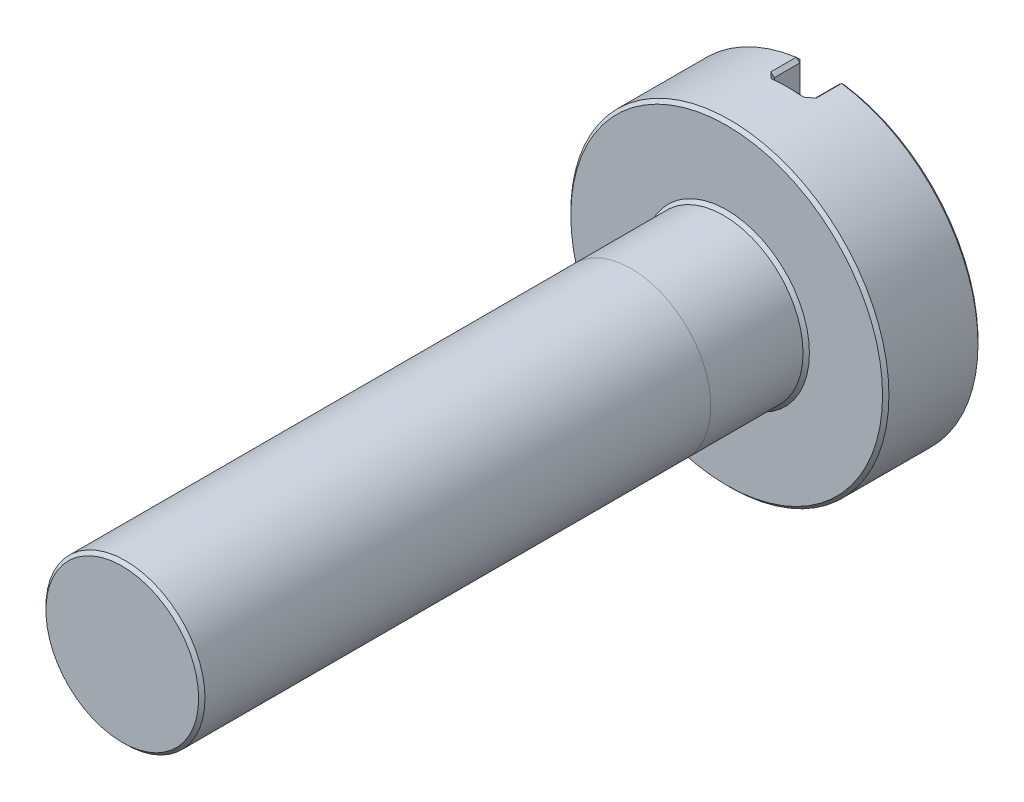
ISO-10303-21;
HEADER;
FILE_DESCRIPTION(('STEP AP214'),'2;1');
FILE_NAME('part.step','',(''),(''),'','','');
FILE_SCHEMA(('AUTOMOTIVE_DESIGN { 1 0 10303 214 1 1 1 1 }'));
ENDSEC;
DATA;
#1=APPLICATION_CONTEXT('core data for automotive mechanical design processes');
#2=APPLICATION_PROTOCOL_DEFINITION('international standard','automotive_design',2000,#1);
#3=PRODUCT_CONTEXT('',#1,'mechanical');
#4=PRODUCT('Part','Part','',(#3));
#5=PRODUCT_RELATED_PRODUCT_CATEGORY('part','',(#4));
#6=PRODUCT_DEFINITION_FORMATION('','',#4);
#7=PRODUCT_DEFINITION_CONTEXT('part definition',#1,'design');
#8=PRODUCT_DEFINITION('design','',#6,#7);
#9=PRODUCT_DEFINITION_SHAPE('','',#8);
#10=(LENGTH_UNIT() NAMED_UNIT(*) SI_UNIT(.MILLI.,.METRE.));
#11=(NAMED_UNIT(*) PLANE_ANGLE_UNIT() SI_UNIT($,.RADIAN.));
#12=(NAMED_UNIT(*) SI_UNIT($,.STERADIAN.) SOLID_ANGLE_UNIT());
#13=UNCERTAINTY_MEASURE_WITH_UNIT(LENGTH_MEASURE(1.E-05),#10,'distance_accuracy_value','');
#14=(GEOMETRIC_REPRESENTATION_CONTEXT(3) GLOBAL_UNCERTAINTY_ASSIGNED_CONTEXT((#13)) GLOBAL_UNIT_ASSIGNED_CONTEXT((#10,
#11,#12)) REPRESENTATION_CONTEXT('',''));
#15=CARTESIAN_POINT('',(0.,0.,0.));
#16=DIRECTION('',(0.,0.,1.));
#17=DIRECTION('',(1.,0.,0.));
#18=AXIS2_PLACEMENT_3D('',#15,#16,#17);
#19=CARTESIAN_POINT('',(0.,0.,11.));
#20=DIRECTION('',(0.,0.,-1.));
#21=DIRECTION('',(-1.,0.,0.));
#22=AXIS2_PLACEMENT_3D('',#19,#20,#21);
#23=CYLINDRICAL_SURFACE('',#22,1.25);
#24=CARTESIAN_POINT('',(0.,0.,10.95));
#25=DIRECTION('',(0.,0.,1.));
#26=DIRECTION('',(1.,0.,0.));
#27=AXIS2_PLACEMENT_3D('',#24,#25,#26);
#28=CIRCLE('',#27,1.25);
#29=CARTESIAN_POINT('',(1.25,0.,10.95));
#30=VERTEX_POINT('',#29);
#31=EDGE_CURVE('E202',#30,#30,#28,.F.);
#32=ORIENTED_EDGE('',*,*,#31,.T.);
#33=EDGE_LOOP('',(#32));
#34=FACE_BOUND('',#33,.T.);
#35=CARTESIAN_POINT('',(0.,0.,3.));
#36=DIRECTION('',(0.,0.,-1.));
#37=DIRECTION('',(0.,1.,0.));
#38=AXIS2_PLACEMENT_3D('',#35,#36,#37);
#39=CIRCLE('',#38,1.25);
#40=CARTESIAN_POINT('',(0.,1.25,3.));
#41=VERTEX_POINT('',#40);
#42=EDGE_CURVE('E11',#41,#41,#39,.T.);
#43=ORIENTED_EDGE('',*,*,#42,.F.);
#44=EDGE_LOOP('',(#43));
#45=FACE_BOUND('',#44,.T.);
#46=ADVANCED_FACE('F39',(#34,#45),#23,.T.);
#47=CARTESIAN_POINT('',(0.,0.,1.5));
#48=DIRECTION('',(0.,0.,-1.));
#49=DIRECTION('',(-1.,0.,0.));
#50=AXIS2_PLACEMENT_3D('',#47,#48,#49);
#51=CYLINDRICAL_SURFACE('',#50,2.5);
#52=CARTESIAN_POINT('',(0.,0.,1.45));
#53=DIRECTION('',(0.,0.,1.));
#54=DIRECTION('',(1.,0.,0.));
#55=AXIS2_PLACEMENT_3D('',#52,#53,#54);
#56=CIRCLE('',#55,2.5);
#57=CARTESIAN_POINT('',(2.5,0.,1.45));
#58=VERTEX_POINT('',#57);
#59=EDGE_CURVE('E49',#58,#58,#56,.F.);
#60=ORIENTED_EDGE('',*,*,#59,.T.);
#61=EDGE_LOOP('',(#60));
#62=FACE_BOUND('',#61,.T.);
#63=CARTESIAN_POINT('',(-0.35714285714285,2.47435829652697,0.450000000000004));
#64=CARTESIAN_POINT('',(-0.348283128722035,2.4756370233307,0.458865877617218));
#65=CARTESIAN_POINT('',(-0.339398611806149,2.47687086598074,0.467713515476649));
#66=CARTESIAN_POINT('',(-0.321576086205335,2.47924782192304,0.48536700661951));
#67=CARTESIAN_POINT('',(-0.312638077482019,2.48039093515017,0.494172859872945));
#68=CARTESIAN_POINT('',(-0.287577804069122,2.48345759248474,0.518717759601294));
#69=CARTESIAN_POINT('',(-0.271391793277387,2.48527929599122,0.534404490480513));
#70=CARTESIAN_POINT('',(-0.255102040818703,2.48695053203171,0.549999999998309));
#71=B_SPLINE_CURVE_WITH_KNOTS('',3,(#63,#64,#65,#66,#67,#68,#69,#70),.UNSPECIFIED.,.F.,.F.,(4,2,
2,4),(0.,0.0377968117810534,0.0755936506896842,0.143431941871298),.UNSPECIFIED.);
#72=CARTESIAN_POINT('',(-0.35714285714285,2.47435829652697,0.450000000000004));
#73=VERTEX_POINT('',#72);
#74=CARTESIAN_POINT('',(-0.255102040816332,2.48695053203142,0.549999999999996));
#75=VERTEX_POINT('',#74);
#76=EDGE_CURVE('E530',#73,#75,#71,.T.);
#77=ORIENTED_EDGE('',*,*,#76,.F.);
#78=DIRECTION('',(0.,0.,-1.));
#79=VECTOR('',#78,1.);
#80=CARTESIAN_POINT('',(-0.35714285714285,2.47435829652697,1.5));
#81=LINE('',#80,#79);
#82=CARTESIAN_POINT('',(-0.35714285714285,2.47435829652697,0.0500000000000001));
#83=VERTEX_POINT('',#82);
#84=EDGE_CURVE('E536',#73,#83,#81,.T.);
#85=ORIENTED_EDGE('',*,*,#84,.T.);
#86=CARTESIAN_POINT('',(0.,0.,0.0500000000000001));
#87=DIRECTION('',(0.,0.,1.));
#88=DIRECTION('',(1.,0.,0.));
#89=AXIS2_PLACEMENT_3D('',#86,#87,#88);
#90=CIRCLE('',#89,2.5);
#91=CARTESIAN_POINT('',(-0.35714285714285,-2.47435829652697,0.0500000000000001));
#92=VERTEX_POINT('',#91);
#93=EDGE_CURVE('E616',#83,#92,#90,.T.);
#94=ORIENTED_EDGE('',*,*,#93,.T.);
#95=DIRECTION('',(0.,0.,-1.));
#96=VECTOR('',#95,1.);
#97=CARTESIAN_POINT('',(-0.35714285714285,-2.47435829652697,1.5));
#98=LINE('',#97,#96);
#99=CARTESIAN_POINT('',(-0.35714285714285,-2.47435829652697,0.450000000000004));
#100=VERTEX_POINT('',#99);
#101=EDGE_CURVE('E578',#92,#100,#98,.F.);
#102=ORIENTED_EDGE('',*,*,#101,.T.);
#103=CARTESIAN_POINT('',(-0.255102040816332,-2.48695053203142,0.549999999999996));
#104=CARTESIAN_POINT('',(-0.264178191386566,-2.48601946587716,0.541311288497497));
#105=CARTESIAN_POINT('',(-0.273221965792443,-2.4850416341085,0.532593929796566));
#106=CARTESIAN_POINT('',(-0.291248879878855,-2.48299345678886,0.515107548357692));
#107=CARTESIAN_POINT('',(-0.300232019629447,-2.48192311134479,0.506338525679462));
#108=CARTESIAN_POINT('',(-0.325259245581333,-2.47880383809925,0.481766412545427));
#109=CARTESIAN_POINT('',(-0.34124058304598,-2.47665328543811,0.465912171417903));
#110=CARTESIAN_POINT('',(-0.35714285714285,-2.47435829652697,0.450000000000004));
#111=B_SPLINE_CURVE_WITH_KNOTS('',3,(#103,#104,#105,#106,#107,#108,#109,#110),.UNSPECIFIED.,.F.,
.F.,(4,2,2,4),(0.,0.0377969208692501,0.0755937980611974,0.143432033029279),.UNSPECIFIED.);
#112=CARTESIAN_POINT('',(-0.255102040816332,-2.48695053203142,0.549999999999996));
#113=VERTEX_POINT('',#112);
#114=EDGE_CURVE('E571',#113,#100,#111,.T.);
#115=ORIENTED_EDGE('',*,*,#114,.F.);
#116=CARTESIAN_POINT('',(0.,0.,0.549999999999996));
#117=DIRECTION('',(0.,0.,-1.));
#118=DIRECTION('',(-1.,0.,0.));
#119=AXIS2_PLACEMENT_3D('',#116,#117,#118);
#120=CIRCLE('',#119,2.5);
#121=CARTESIAN_POINT('',(0.255102040816332,-2.48695053203142,0.549999999999996));
#122=VERTEX_POINT('',#121);
#123=EDGE_CURVE('E630',#113,#122,#120,.F.);
#124=ORIENTED_EDGE('',*,*,#123,.T.);
#125=CARTESIAN_POINT('',(0.357142857142852,-2.47435829652697,0.450000000000004));
#126=CARTESIAN_POINT('',(0.348283128722036,-2.4756370233307,0.458865877617218));
#127=CARTESIAN_POINT('',(0.33939861180615,-2.47687086598074,0.467713515476649));
#128=CARTESIAN_POINT('',(0.321576086205336,-2.47924782192304,0.48536700661951));
#129=CARTESIAN_POINT('',(0.31263807748202,-2.48039093515017,0.494172859872945));
#130=CARTESIAN_POINT('',(0.287577804069123,-2.48345759248474,0.518717759601294));
#131=CARTESIAN_POINT('',(0.271391793277388,-2.48527929599122,0.534404490480513));
#132=CARTESIAN_POINT('',(0.255102040818703,-2.48695053203171,0.549999999998309));
#133=B_SPLINE_CURVE_WITH_KNOTS('',3,(#125,#126,#127,#128,#129,#130,#131,#132),.UNSPECIFIED.,.F.,
.F.,(4,2,2,4),(0.,0.0377968117810536,0.0755936506896844,0.143431941871299),.UNSPECIFIED.);
#134=CARTESIAN_POINT('',(0.357142857142852,-2.47435829652697,0.450000000000004));
#135=VERTEX_POINT('',#134);
#136=EDGE_CURVE('E146',#135,#122,#133,.T.);
#137=ORIENTED_EDGE('',*,*,#136,.F.);
#138=DIRECTION('',(0.,0.,-1.));
#139=VECTOR('',#138,1.);
#140=CARTESIAN_POINT('',(0.357142857142852,-2.47435829652697,1.5));
#141=LINE('',#140,#139);
#142=CARTESIAN_POINT('',(0.357142857142852,-2.47435829652697,0.0500000000000001));
#143=VERTEX_POINT('',#142);
#144=EDGE_CURVE('E141',#135,#143,#141,.T.);
#145=ORIENTED_EDGE('',*,*,#144,.T.);
#146=CARTESIAN_POINT('',(0.,0.,0.0500000000000001));
#147=DIRECTION('',(0.,0.,1.));
#148=DIRECTION('',(1.,0.,0.));
#149=AXIS2_PLACEMENT_3D('',#146,#147,#148);
#150=CIRCLE('',#149,2.5);
#151=CARTESIAN_POINT('',(0.35714285714285,2.47435829652697,0.0500000000000001));
#152=VERTEX_POINT('',#151);
#153=EDGE_CURVE('E144',#143,#152,#150,.T.);
#154=ORIENTED_EDGE('',*,*,#153,.T.);
#155=DIRECTION('',(0.,0.,-1.));
#156=VECTOR('',#155,1.);
#157=CARTESIAN_POINT('',(0.35714285714285,2.47435829652697,1.5));
#158=LINE('',#157,#156);
#159=CARTESIAN_POINT('',(0.35714285714285,2.47435829652697,0.450000000000004));
#160=VERTEX_POINT('',#159);
#161=EDGE_CURVE('E151',#152,#160,#158,.F.);
#162=ORIENTED_EDGE('',*,*,#161,.T.);
#163=CARTESIAN_POINT('',(0.255102040816332,2.48695053203142,0.549999999999996));
#164=CARTESIAN_POINT('',(0.264178191386566,2.48601946587716,0.541311288497497));
#165=CARTESIAN_POINT('',(0.273221965792443,2.4850416341085,0.532593929796566));
#166=CARTESIAN_POINT('',(0.291248879878855,2.48299345678886,0.515107548357692));
#167=CARTESIAN_POINT('',(0.300232019629447,2.48192311134479,0.506338525679462));
#168=CARTESIAN_POINT('',(0.325259245581333,2.47880383809925,0.481766412545427));
#169=CARTESIAN_POINT('',(0.34124058304598,2.47665328543811,0.465912171417903));
#170=CARTESIAN_POINT('',(0.35714285714285,2.47435829652697,0.450000000000004));
#171=B_SPLINE_CURVE_WITH_KNOTS('',3,(#163,#164,#165,#166,#167,#168,#169,#170),.UNSPECIFIED.,.F.,
.F.,(4,2,2,4),(0.,0.0377969208692501,0.0755937980611974,0.143432033029279),.UNSPECIFIED.);
#172=CARTESIAN_POINT('',(0.255102040816332,2.48695053203142,0.549999999999996));
#173=VERTEX_POINT('',#172);
#174=EDGE_CURVE('E564',#173,#160,#171,.T.);
#175=ORIENTED_EDGE('',*,*,#174,.F.);
#176=CARTESIAN_POINT('',(0.,0.,0.549999999999996));
#177=DIRECTION('',(0.,0.,-1.));
#178=DIRECTION('',(-1.,0.,0.));
#179=AXIS2_PLACEMENT_3D('',#176,#177,#178);
#180=CIRCLE('',#179,2.5);
#181=EDGE_CURVE('E410',#173,#75,#180,.F.);
#182=ORIENTED_EDGE('',*,*,#181,.T.);
#183=EDGE_LOOP('',(#77,#85,#94,#102,#115,#124,#137,#145,#154,#162,#175,#182));
#184=FACE_BOUND('',#183,.T.);
#185=ADVANCED_FACE('F143',(#62,#184),#51,.T.);
#186=CARTESIAN_POINT('',(0.,0.,0.));
#187=DIRECTION('',(0.,0.,1.));
#188=DIRECTION('',(1.,0.,0.));
#189=AXIS2_PLACEMENT_3D('',#186,#187,#188);
#190=PLANE('',#189);
#191=CARTESIAN_POINT('',(0.,0.,0.));
#192=DIRECTION('',(0.,0.,1.));
#193=DIRECTION('',(1.,0.,0.));
#194=AXIS2_PLACEMENT_3D('',#191,#192,#193);
#195=CIRCLE('',#194,2.45);
#196=CARTESIAN_POINT('',(0.349999999999999,2.42487113059643,0.));
#197=VERTEX_POINT('',#196);
#198=CARTESIAN_POINT('',(0.349999999999999,-2.42487113059643,0.));
#199=VERTEX_POINT('',#198);
#200=EDGE_CURVE('E55',#197,#199,#195,.F.);
#201=ORIENTED_EDGE('',*,*,#200,.T.);
#202=DIRECTION('',(0.,1.,0.));
#203=VECTOR('',#202,1.);
#204=CARTESIAN_POINT('',(0.349999999999999,0.,0.));
#205=LINE('',#204,#203);
#206=EDGE_CURVE('E199',#199,#197,#205,.T.);
#207=ORIENTED_EDGE('',*,*,#206,.T.);
#208=EDGE_LOOP('',(#201,#207));
#209=FACE_BOUND('',#208,.T.);
#210=ADVANCED_FACE('F234',(#209),#190,.F.);
#211=ORIENTED_EDGE('',*,*,#42,.T.);
#212=EDGE_LOOP('',(#211));
#213=FACE_BOUND('',#212,.T.);
#214=CARTESIAN_POINT('',(0.,0.,1.55));
#215=DIRECTION('',(0.,0.,1.));
#216=DIRECTION('',(1.,0.,0.));
#217=AXIS2_PLACEMENT_3D('',#214,#215,#216);
#218=CIRCLE('',#217,1.25);
#219=CARTESIAN_POINT('',(1.25,0.,1.55));
#220=VERTEX_POINT('',#219);
#221=EDGE_CURVE('E198',#220,#220,#218,.T.);
#222=ORIENTED_EDGE('',*,*,#221,.T.);
#223=EDGE_LOOP('',(#222));
#224=FACE_BOUND('',#223,.T.);
#225=ADVANCED_FACE('F232',(#213,#224),#23,.T.);
#226=CARTESIAN_POINT('',(0.,0.,11.));
#227=DIRECTION('',(0.,0.,1.));
#228=DIRECTION('',(1.,0.,0.));
#229=AXIS2_PLACEMENT_3D('',#226,#227,#228);
#230=PLANE('',#229);
#231=CARTESIAN_POINT('',(0.,0.,11.));
#232=DIRECTION('',(0.,0.,1.));
#233=DIRECTION('',(1.,0.,0.));
#234=AXIS2_PLACEMENT_3D('',#231,#232,#233);
#235=CIRCLE('',#234,1.2);
#236=CARTESIAN_POINT('',(1.2,0.,11.));
#237=VERTEX_POINT('',#236);
#238=EDGE_CURVE('E195',#237,#237,#235,.T.);
#239=ORIENTED_EDGE('',*,*,#238,.T.);
#240=EDGE_LOOP('',(#239));
#241=FACE_BOUND('',#240,.T.);
#242=ADVANCED_FACE('F224',(#241),#230,.T.);
#243=CARTESIAN_POINT('',(0.,0.,1.5));
#244=DIRECTION('',(0.,0.,1.));
#245=DIRECTION('',(1.,0.,0.));
#246=AXIS2_PLACEMENT_3D('',#243,#244,#245);
#247=PLANE('',#246);
#248=CARTESIAN_POINT('',(0.,0.,1.5));
#249=DIRECTION('',(0.,0.,1.));
#250=DIRECTION('',(1.,0.,0.));
#251=AXIS2_PLACEMENT_3D('',#248,#249,#250);
#252=CIRCLE('',#251,2.45);
#253=CARTESIAN_POINT('',(2.45,0.,1.5));
#254=VERTEX_POINT('',#253);
#255=EDGE_CURVE('E208',#254,#254,#252,.T.);
#256=ORIENTED_EDGE('',*,*,#255,.T.);
#257=EDGE_LOOP('',(#256));
#258=FACE_BOUND('',#257,.T.);
#259=CARTESIAN_POINT('',(0.,0.,1.5));
#260=DIRECTION('',(0.,0.,1.));
#261=DIRECTION('',(1.,0.,0.));
#262=AXIS2_PLACEMENT_3D('',#259,#260,#261);
#263=CIRCLE('',#262,1.3);
#264=CARTESIAN_POINT('',(1.3,0.,1.5));
#265=VERTEX_POINT('',#264);
#266=EDGE_CURVE('E205',#265,#265,#263,.F.);
#267=ORIENTED_EDGE('',*,*,#266,.T.);
#268=EDGE_LOOP('',(#267));
#269=FACE_BOUND('',#268,.T.);
#270=ADVANCED_FACE('F220',(#258,#269),#247,.T.);
#271=CARTESIAN_POINT('',(0.,0.,0.));
#272=DIRECTION('',(0.,0.,1.));
#273=DIRECTION('',(1.,0.,0.));
#274=AXIS2_PLACEMENT_3D('',#271,#272,#273);
#275=CIRCLE('',#274,2.45);
#276=CARTESIAN_POINT('',(-0.349999999999999,-2.42487113059643,0.));
#277=VERTEX_POINT('',#276);
#278=CARTESIAN_POINT('',(-0.349999999999999,2.42487113059643,0.));
#279=VERTEX_POINT('',#278);
#280=EDGE_CURVE('E428',#277,#279,#275,.F.);
#281=ORIENTED_EDGE('',*,*,#280,.T.);
#282=DIRECTION('',(0.,-1.,0.));
#283=VECTOR('',#282,1.);
#284=CARTESIAN_POINT('',(-0.349999999999999,0.,0.));
#285=LINE('',#284,#283);
#286=EDGE_CURVE('E430',#279,#277,#285,.T.);
#287=ORIENTED_EDGE('',*,*,#286,.T.);
#288=EDGE_LOOP('',(#281,#287));
#289=FACE_BOUND('',#288,.T.);
#290=ADVANCED_FACE('F223',(#289),#190,.F.);
#291=CARTESIAN_POINT('',(0.,0.,0.5));
#292=DIRECTION('',(0.,0.,-1.));
#293=DIRECTION('',(-1.,0.,0.));
#294=AXIS2_PLACEMENT_3D('',#291,#292,#293);
#295=PLANE('',#294);
#296=CARTESIAN_POINT('',(0.,0.,0.5));
#297=DIRECTION('',(0.,0.,-1.));
#298=DIRECTION('',(-1.,0.,0.));
#299=AXIS2_PLACEMENT_3D('',#296,#297,#298);
#300=CIRCLE('',#299,2.45000000000001);
#301=CARTESIAN_POINT('',(0.250000000000006,-2.43721152139079,0.5));
#302=VERTEX_POINT('',#301);
#303=CARTESIAN_POINT('',(-0.250000000000006,-2.43721152139079,0.5));
#304=VERTEX_POINT('',#303);
#305=EDGE_CURVE('E419',#302,#304,#300,.T.);
#306=ORIENTED_EDGE('',*,*,#305,.T.);
#307=DIRECTION('',(0.,1.,0.));
#308=VECTOR('',#307,1.);
#309=CARTESIAN_POINT('',(-0.250000000000006,0.,0.5));
#310=LINE('',#309,#308);
#311=CARTESIAN_POINT('',(-0.250000000000006,2.43721152139079,0.5));
#312=VERTEX_POINT('',#311);
#313=EDGE_CURVE('E421',#304,#312,#310,.T.);
#314=ORIENTED_EDGE('',*,*,#313,.T.);
#315=CARTESIAN_POINT('',(0.,0.,0.5));
#316=DIRECTION('',(0.,0.,-1.));
#317=DIRECTION('',(-1.,0.,0.));
#318=AXIS2_PLACEMENT_3D('',#315,#316,#317);
#319=CIRCLE('',#318,2.45000000000001);
#320=CARTESIAN_POINT('',(0.250000000000006,2.43721152139079,0.5));
#321=VERTEX_POINT('',#320);
#322=EDGE_CURVE('E408',#312,#321,#319,.T.);
#323=ORIENTED_EDGE('',*,*,#322,.T.);
#324=DIRECTION('',(0.,-1.,0.));
#325=VECTOR('',#324,1.);
#326=CARTESIAN_POINT('',(0.250000000000006,0.,0.5));
#327=LINE('',#326,#325);
#328=EDGE_CURVE('E416',#321,#302,#327,.T.);
#329=ORIENTED_EDGE('',*,*,#328,.T.);
#330=EDGE_LOOP('',(#306,#314,#323,#329));
#331=FACE_BOUND('',#330,.T.);
#332=ADVANCED_FACE('F666',(#331),#295,.T.);
#333=CARTESIAN_POINT('',(0.3,-2.97219755952938,0.5));
#334=DIRECTION('',(1.,0.,0.));
#335=DIRECTION('',(0.,0.,-1.));
#336=AXIS2_PLACEMENT_3D('',#333,#334,#335);
#337=PLANE('',#336);
#338=DIRECTION('',(0.,0.,1.));
#339=VECTOR('',#338,1.);
#340=CARTESIAN_POINT('',(0.3,-2.42487113059643,0.5));
#341=LINE('',#340,#339);
#342=CARTESIAN_POINT('',(0.3,-2.42487113059643,0.0500000000000001));
#343=VERTEX_POINT('',#342);
#344=CARTESIAN_POINT('',(0.3,-2.42487113059643,0.450000000000004));
#345=VERTEX_POINT('',#344);
#346=EDGE_CURVE('E171',#343,#345,#341,.T.);
#347=ORIENTED_EDGE('',*,*,#346,.T.);
#348=DIRECTION('',(0.,1.,0.));
#349=VECTOR('',#348,1.);
#350=CARTESIAN_POINT('',(0.3,-2.97219755952938,0.450000000000004));
#351=LINE('',#350,#349);
#352=CARTESIAN_POINT('',(0.3,2.42487113059643,0.450000000000004));
#353=VERTEX_POINT('',#352);
#354=EDGE_CURVE('E423',#345,#353,#351,.T.);
#355=ORIENTED_EDGE('',*,*,#354,.T.);
#356=DIRECTION('',(0.,0.,-1.));
#357=VECTOR('',#356,1.);
#358=CARTESIAN_POINT('',(0.3,2.42487113059643,0.5));
#359=LINE('',#358,#357);
#360=CARTESIAN_POINT('',(0.3,2.42487113059643,0.0500000000000001));
#361=VERTEX_POINT('',#360);
#362=EDGE_CURVE('E656',#353,#361,#359,.T.);
#363=ORIENTED_EDGE('',*,*,#362,.T.);
#364=DIRECTION('',(0.,-1.,0.));
#365=VECTOR('',#364,1.);
#366=CARTESIAN_POINT('',(0.3,-2.97219755952938,0.0500000000000001));
#367=LINE('',#366,#365);
#368=EDGE_CURVE('E652',#361,#343,#367,.T.);
#369=ORIENTED_EDGE('',*,*,#368,.T.);
#370=EDGE_LOOP('',(#347,#355,#363,#369));
#371=FACE_BOUND('',#370,.T.);
#372=ADVANCED_FACE('F660',(#371),#337,.F.);
#373=CARTESIAN_POINT('',(-0.3,-2.97219755952938,0.5));
#374=DIRECTION('',(-1.,0.,0.));
#375=DIRECTION('',(0.,0.,1.));
#376=AXIS2_PLACEMENT_3D('',#373,#374,#375);
#377=PLANE('',#376);
#378=DIRECTION('',(0.,0.,1.));
#379=VECTOR('',#378,1.);
#380=CARTESIAN_POINT('',(-0.3,2.42487113059643,0.5));
#381=LINE('',#380,#379);
#382=CARTESIAN_POINT('',(-0.3,2.42487113059643,0.0500000000000001));
#383=VERTEX_POINT('',#382);
#384=CARTESIAN_POINT('',(-0.3,2.42487113059643,0.450000000000004));
#385=VERTEX_POINT('',#384);
#386=EDGE_CURVE('E538',#383,#385,#381,.T.);
#387=ORIENTED_EDGE('',*,*,#386,.T.);
#388=DIRECTION('',(0.,-1.,0.));
#389=VECTOR('',#388,1.);
#390=CARTESIAN_POINT('',(-0.3,-2.97219755952938,0.450000000000004));
#391=LINE('',#390,#389);
#392=CARTESIAN_POINT('',(-0.3,-2.42487113059643,0.450000000000004));
#393=VERTEX_POINT('',#392);
#394=EDGE_CURVE('E650',#385,#393,#391,.T.);
#395=ORIENTED_EDGE('',*,*,#394,.T.);
#396=DIRECTION('',(0.,0.,-1.));
#397=VECTOR('',#396,1.);
#398=CARTESIAN_POINT('',(-0.3,-2.42487113059643,0.5));
#399=LINE('',#398,#397);
#400=CARTESIAN_POINT('',(-0.3,-2.42487113059643,0.0500000000000001));
#401=VERTEX_POINT('',#400);
#402=EDGE_CURVE('E648',#393,#401,#399,.T.);
#403=ORIENTED_EDGE('',*,*,#402,.T.);
#404=DIRECTION('',(0.,1.,0.));
#405=VECTOR('',#404,1.);
#406=CARTESIAN_POINT('',(-0.3,-2.97219755952938,0.0500000000000001));
#407=LINE('',#406,#405);
#408=EDGE_CURVE('E535',#401,#383,#407,.T.);
#409=ORIENTED_EDGE('',*,*,#408,.T.);
#410=EDGE_LOOP('',(#387,#395,#403,#409));
#411=FACE_BOUND('',#410,.T.);
#412=ADVANCED_FACE('F284',(#411),#377,.F.);
#413=CARTESIAN_POINT('',(0.3,2.42487113059643,0.0500000000000001));
#414=DIRECTION('',(-0.547722557505157,0.632455532033648,-0.547722557505208));
#415=DIRECTION('',(0.,0.654653670708022,0.755928946018416));
#416=AXIS2_PLACEMENT_3D('',#413,#414,#415);
#417=PLANE('',#416);
#418=DIRECTION('',(0.755928946018446,0.654653670707987,0.));
#419=VECTOR('',#418,1.);
#420=CARTESIAN_POINT('',(0.3,2.42487113059643,0.0500000000000001));
#421=LINE('',#420,#419);
#422=EDGE_CURVE('E167',#152,#361,#421,.F.);
#423=ORIENTED_EDGE('',*,*,#422,.F.);
#424=DIRECTION('',(-0.101015254455134,-0.699854212223772,-0.707106781186554));
#425=VECTOR('',#424,1.);
#426=CARTESIAN_POINT('',(1.03684810889415E-13,-1.19724906955755E-13,-2.44999999999994));
#427=LINE('',#426,#425);
#428=EDGE_CURVE('E157',#197,#152,#427,.F.);
#429=ORIENTED_EDGE('',*,*,#428,.F.);
#430=DIRECTION('',(0.707106781186541,0.,-0.707106781186554));
#431=VECTOR('',#430,1.);
#432=CARTESIAN_POINT('',(0.3,2.42487113059643,0.0500000000000001));
#433=LINE('',#432,#431);
#434=EDGE_CURVE('E191',#361,#197,#433,.T.);
#435=ORIENTED_EDGE('',*,*,#434,.F.);
#436=EDGE_LOOP('',(#423,#429,#435));
#437=FACE_BOUND('',#436,.T.);
#438=ADVANCED_FACE('F273',(#437),#417,.T.);
#439=CARTESIAN_POINT('',(0.,0.,0.0500000000000001));
#440=DIRECTION('',(0.,0.,1.));
#441=DIRECTION('',(1.,0.,0.));
#442=AXIS2_PLACEMENT_3D('',#439,#440,#441);
#443=CONICAL_SURFACE('',#442,2.5,0.78539816339744);
#444=ORIENTED_EDGE('',*,*,#428,.T.);
#445=ORIENTED_EDGE('',*,*,#153,.F.);
#446=DIRECTION('',(0.10101525445516,-0.699854212223768,0.707106781186553));
#447=VECTOR('',#446,1.);
#448=CARTESIAN_POINT('',(0.,0.,-2.44999999999997));
#449=LINE('',#448,#447);
#450=EDGE_CURVE('E155',#199,#143,#449,.T.);
#451=ORIENTED_EDGE('',*,*,#450,.F.);
#452=ORIENTED_EDGE('',*,*,#200,.F.);
#453=EDGE_LOOP('',(#444,#445,#451,#452));
#454=FACE_BOUND('',#453,.T.);
#455=ADVANCED_FACE('F154',(#454),#443,.T.);
#456=CARTESIAN_POINT('',(0.349999999999999,0.,0.));
#457=DIRECTION('',(0.707106781186554,0.,0.707106781186541));
#458=DIRECTION('',(0.,1.,0.));
#459=AXIS2_PLACEMENT_3D('',#456,#457,#458);
#460=PLANE('',#459);
#461=ORIENTED_EDGE('',*,*,#434,.T.);
#462=ORIENTED_EDGE('',*,*,#206,.F.);
#463=DIRECTION('',(-0.707106781186541,0.,0.707106781186554));
#464=VECTOR('',#463,1.);
#465=CARTESIAN_POINT('',(0.328571428571423,-2.42487113059643,0.0214285714285769));
#466=LINE('',#465,#464);
#467=EDGE_CURVE('E166',#343,#199,#466,.F.);
#468=ORIENTED_EDGE('',*,*,#467,.F.);
#469=ORIENTED_EDGE('',*,*,#368,.F.);
#470=EDGE_LOOP('',(#461,#462,#468,#469));
#471=FACE_BOUND('',#470,.T.);
#472=ADVANCED_FACE('F291',(#471),#460,.F.);
#473=CARTESIAN_POINT('',(0.35714285714285,2.47435829652697,1.5));
#474=DIRECTION('',(-0.654653670707987,0.755928946018446,0.));
#475=DIRECTION('',(0.,0.,-1.));
#476=AXIS2_PLACEMENT_3D('',#473,#474,#475);
#477=PLANE('',#476);
#478=ORIENTED_EDGE('',*,*,#422,.T.);
#479=ORIENTED_EDGE('',*,*,#362,.F.);
#480=DIRECTION('',(-0.755928946018446,-0.654653670707987,0.));
#481=VECTOR('',#480,1.);
#482=CARTESIAN_POINT('',(0.35714285714285,2.47435829652697,0.450000000000004));
#483=LINE('',#482,#481);
#484=EDGE_CURVE('E172',#160,#353,#483,.T.);
#485=ORIENTED_EDGE('',*,*,#484,.F.);
#486=ORIENTED_EDGE('',*,*,#161,.F.);
#487=EDGE_LOOP('',(#478,#479,#485,#486));
#488=FACE_BOUND('',#487,.T.);
#489=ADVANCED_FACE('F297',(#488),#477,.T.);
#490=CARTESIAN_POINT('',(0.357142857142852,-2.47435829652697,0.0500000000000001));
#491=DIRECTION('',(-0.547722557505142,-0.632455532033665,-0.547722557505204));
#492=DIRECTION('',(0.,0.654653670708009,-0.755928946018426));
#493=AXIS2_PLACEMENT_3D('',#490,#491,#492);
#494=PLANE('',#493);
#495=ORIENTED_EDGE('',*,*,#467,.T.);
#496=ORIENTED_EDGE('',*,*,#450,.T.);
#497=DIRECTION('',(0.755928946018463,-0.654653670707967,0.));
#498=VECTOR('',#497,1.);
#499=CARTESIAN_POINT('',(0.357142857142852,-2.47435829652697,0.0500000000000001));
#500=LINE('',#499,#498);
#501=EDGE_CURVE('E163',#343,#143,#500,.T.);
#502=ORIENTED_EDGE('',*,*,#501,.F.);
#503=EDGE_LOOP('',(#495,#496,#502));
#504=FACE_BOUND('',#503,.T.);
#505=ADVANCED_FACE('F162',(#504),#494,.T.);
#506=CARTESIAN_POINT('',(0.250000000000006,2.43721152139079,0.5));
#507=CARTESIAN_POINT('',(0.3,2.42487113059643,0.450000000000004));
#508=CARTESIAN_POINT('',(0.255102040816332,2.48695053203142,0.549999999999996));
#509=CARTESIAN_POINT('',(0.35714285714285,2.47435829652697,0.450000000000004));
#510=CARTESIAN_POINT('',(0.255185023576892,2.48775951819187,0.550813231053487));
#511=CARTESIAN_POINT('',(0.358072264061126,2.47516318652865,0.450000000000004));
#512=B_SPLINE_SURFACE_WITH_KNOTS('',1,1,((#506,#507),(#508,#509),(#510,#511)),.UNSPECIFIED.,.F.,
.F.,.F.,(2,1,2),(2,2),(0.,1.,1.01626462106983),(0.,1.),.UNSPECIFIED.);
#513=CARTESIAN_POINT('',(0.3,2.42487113059643,0.450000000000004));
#514=CARTESIAN_POINT('',(0.29561196801493,2.42595413118671,0.454388031985074));
#515=CARTESIAN_POINT('',(0.291223936029861,2.42703713177699,0.458776063970144));
#516=CARTESIAN_POINT('',(0.282447872059722,2.42920313295755,0.467552127940283));
#517=CARTESIAN_POINT('',(0.278059840074652,2.43028613354782,0.471940159925353));
#518=CARTESIAN_POINT('',(0.265781205393057,2.43331659655567,0.484218794606948));
#519=CARTESIAN_POINT('',(0.257890602696532,2.43526405897323,0.492109397303474));
#520=CARTESIAN_POINT('',(0.250000000000006,2.43721152139079,0.5));
#521=B_SPLINE_CURVE_WITH_KNOTS('',3,(#513,#514,#515,#516,#517,#518,#519,#520),.UNSPECIFIED.,.F.,
.F.,(4,2,2,4),(0.,0.0188982236504593,0.0377964473009186,0.0717794207621969),.UNSPECIFIED.);
#522=EDGE_CURVE('E173',#321,#353,#521,.F.);
#523=DIRECTION('',(0.0721537531823006,0.703415834269951,0.707106781186559));
#524=VECTOR('',#523,1.);
#525=CARTESIAN_POINT('',(0.250000000000006,2.43721152139079,0.5));
#526=LINE('',#525,#524);
#527=EDGE_CURVE('E178',#173,#321,#526,.F.);
#528=ORIENTED_EDGE('',*,*,#174,.T.);
#529=ORIENTED_EDGE('',*,*,#484,.T.);
#530=ORIENTED_EDGE('',*,*,#522,.F.);
#531=ORIENTED_EDGE('',*,*,#527,.F.);
#532=EDGE_LOOP('',(#528,#529,#530,#531));
#533=FACE_BOUND('',#532,.T.);
#534=ADVANCED_FACE('F310',(#533),#512,.T.);
#535=CARTESIAN_POINT('',(0.357142857142852,-2.47435829652697,1.5));
#536=DIRECTION('',(0.654653670707968,0.755928946018463,0.));
#537=DIRECTION('',(0.,0.,-1.));
#538=AXIS2_PLACEMENT_3D('',#535,#536,#537);
#539=PLANE('',#538);
#540=ORIENTED_EDGE('',*,*,#501,.T.);
#541=ORIENTED_EDGE('',*,*,#144,.F.);
#542=DIRECTION('',(0.755928946018463,-0.654653670707967,0.));
#543=VECTOR('',#542,1.);
#544=CARTESIAN_POINT('',(0.3,-2.42487113059643,0.450000000000004));
#545=LINE('',#544,#543);
#546=EDGE_CURVE('E396',#345,#135,#545,.T.);
#547=ORIENTED_EDGE('',*,*,#546,.F.);
#548=ORIENTED_EDGE('',*,*,#346,.F.);
#549=EDGE_LOOP('',(#540,#541,#547,#548));
#550=FACE_BOUND('',#549,.T.);
#551=ADVANCED_FACE('F169',(#550),#539,.F.);
#552=CARTESIAN_POINT('',(0.250000000000006,0.,0.5));
#553=DIRECTION('',(0.70710678118656,0.,0.707106781186535));
#554=DIRECTION('',(0.,-1.,0.));
#555=AXIS2_PLACEMENT_3D('',#552,#553,#554);
#556=PLANE('',#555);
#557=ORIENTED_EDGE('',*,*,#522,.T.);
#558=ORIENTED_EDGE('',*,*,#354,.F.);
#559=CARTESIAN_POINT('',(0.250000000000006,-2.43721152139079,0.5));
#560=CARTESIAN_POINT('',(0.254388031985075,-2.43612852080052,0.49561196801493));
#561=CARTESIAN_POINT('',(0.258776063970145,-2.43504552021024,0.491223936029861));
#562=CARTESIAN_POINT('',(0.267552127940284,-2.43287951902968,0.482447872059721));
#563=CARTESIAN_POINT('',(0.271940159925354,-2.4317965184394,0.478059840074651));
#564=CARTESIAN_POINT('',(0.284218794606949,-2.42876605543156,0.465781205393056));
#565=CARTESIAN_POINT('',(0.292109397303474,-2.426818593014,0.45789060269653));
#566=CARTESIAN_POINT('',(0.3,-2.42487113059643,0.450000000000004));
#567=B_SPLINE_CURVE_WITH_KNOTS('',3,(#559,#560,#561,#562,#563,#564,#565,#566),.UNSPECIFIED.,.F.,
.F.,(4,2,2,4),(0.,0.0188982236504595,0.0377964473009189,0.0717794207621967),.UNSPECIFIED.);
#568=EDGE_CURVE('E389',#302,#345,#567,.T.);
#569=ORIENTED_EDGE('',*,*,#568,.F.);
#570=ORIENTED_EDGE('',*,*,#328,.F.);
#571=EDGE_LOOP('',(#557,#558,#569,#570));
#572=FACE_BOUND('',#571,.T.);
#573=ADVANCED_FACE('F328',(#572),#556,.F.);
#574=CARTESIAN_POINT('',(0.,0.,0.5));
#575=DIRECTION('',(0.,0.,1.));
#576=DIRECTION('',(1.,0.,0.));
#577=AXIS2_PLACEMENT_3D('',#574,#575,#576);
#578=CONICAL_SURFACE('',#577,2.45000000000001,0.785398163397431);
#579=ORIENTED_EDGE('',*,*,#527,.T.);
#580=ORIENTED_EDGE('',*,*,#322,.F.);
#581=DIRECTION('',(0.0721537531823006,-0.703415834269951,-0.707106781186559));
#582=VECTOR('',#581,1.);
#583=CARTESIAN_POINT('',(-0.255102040816332,2.48695053203142,0.549999999999996));
#584=LINE('',#583,#582);
#585=EDGE_CURVE('E397',#75,#312,#584,.T.);
#586=ORIENTED_EDGE('',*,*,#585,.F.);
#587=ORIENTED_EDGE('',*,*,#181,.F.);
#588=EDGE_LOOP('',(#579,#580,#586,#587));
#589=FACE_BOUND('',#588,.T.);
#590=ADVANCED_FACE('F336',(#589),#578,.T.);
#591=CARTESIAN_POINT('',(-0.35714285714285,2.47435829652697,1.5));
#592=DIRECTION('',(-0.654653670707987,-0.755928946018446,0.));
#593=DIRECTION('',(0.,0.,-1.));
#594=AXIS2_PLACEMENT_3D('',#591,#592,#593);
#595=PLANE('',#594);
#596=DIRECTION('',(-0.755928946018446,0.654653670707987,0.));
#597=VECTOR('',#596,1.);
#598=CARTESIAN_POINT('',(-0.35714285714285,2.47435829652697,0.0500000000000001));
#599=LINE('',#598,#597);
#600=EDGE_CURVE('E400',#83,#383,#599,.F.);
#601=ORIENTED_EDGE('',*,*,#600,.F.);
#602=ORIENTED_EDGE('',*,*,#84,.F.);
#603=DIRECTION('',(-0.755928946018446,0.654653670707987,0.));
#604=VECTOR('',#603,1.);
#605=CARTESIAN_POINT('',(-0.3,2.42487113059643,0.450000000000004));
#606=LINE('',#605,#604);
#607=EDGE_CURVE('E533',#385,#73,#606,.T.);
#608=ORIENTED_EDGE('',*,*,#607,.F.);
#609=ORIENTED_EDGE('',*,*,#386,.F.);
#610=EDGE_LOOP('',(#601,#602,#608,#609));
#611=FACE_BOUND('',#610,.T.);
#612=ADVANCED_FACE('F347',(#611),#595,.F.);
#613=CARTESIAN_POINT('',(-0.35714285714285,2.47435829652697,0.0500000000000001));
#614=DIRECTION('',(0.547722557505157,0.632455532033648,-0.547722557505208));
#615=DIRECTION('',(0.,0.654653670708022,0.755928946018416));
#616=AXIS2_PLACEMENT_3D('',#613,#614,#615);
#617=PLANE('',#616);
#618=DIRECTION('',(-0.101015254455134,0.699854212223772,0.707106781186554));
#619=VECTOR('',#618,1.);
#620=CARTESIAN_POINT('',(-1.03803579286768E-13,-1.19862048888121E-13,-2.44999999999994));
#621=LINE('',#620,#619);
#622=EDGE_CURVE('E619',#83,#279,#621,.F.);
#623=ORIENTED_EDGE('',*,*,#622,.F.);
#624=ORIENTED_EDGE('',*,*,#600,.T.);
#625=DIRECTION('',(0.707106781186541,0.,0.707106781186554));
#626=VECTOR('',#625,1.);
#627=CARTESIAN_POINT('',(-0.328571428571422,2.42487113059643,0.0214285714285773));
#628=LINE('',#627,#626);
#629=EDGE_CURVE('E617',#279,#383,#628,.T.);
#630=ORIENTED_EDGE('',*,*,#629,.F.);
#631=EDGE_LOOP('',(#623,#624,#630));
#632=FACE_BOUND('',#631,.T.);
#633=ADVANCED_FACE('F354',(#632),#617,.T.);
#634=CARTESIAN_POINT('',(0.3,-2.42487113059643,0.450000000000004));
#635=CARTESIAN_POINT('',(0.250000000000006,-2.43721152139079,0.5));
#636=CARTESIAN_POINT('',(0.357142857142852,-2.47435829652697,0.450000000000004));
#637=CARTESIAN_POINT('',(0.255102040816332,-2.48695053203142,0.549999999999996));
#638=CARTESIAN_POINT('',(0.358063042571894,-2.47515520048471,0.450000000000004));
#639=CARTESIAN_POINT('',(0.255184200229639,-2.48775149150623,0.550805162250407));
#640=B_SPLINE_SURFACE_WITH_KNOTS('',1,1,((#634,#635),(#636,#637),(#638,#639)),.UNSPECIFIED.,.F.,
.F.,.F.,(2,1,2),(2,2),(0.,1.,1.01610324500823),(0.,1.),.UNSPECIFIED.);
#641=DIRECTION('',(-0.0721537531823006,0.703415834269951,-0.707106781186559));
#642=VECTOR('',#641,1.);
#643=CARTESIAN_POINT('',(0.255102040816332,-2.48695053203142,0.549999999999996));
#644=LINE('',#643,#642);
#645=EDGE_CURVE('E478',#302,#122,#644,.F.);
#646=ORIENTED_EDGE('',*,*,#546,.T.);
#647=ORIENTED_EDGE('',*,*,#136,.T.);
#648=ORIENTED_EDGE('',*,*,#645,.F.);
#649=ORIENTED_EDGE('',*,*,#568,.T.);
#650=EDGE_LOOP('',(#646,#647,#648,#649));
#651=FACE_BOUND('',#650,.T.);
#652=ADVANCED_FACE('F361',(#651),#640,.T.);
#653=CARTESIAN_POINT('',(-0.3,2.42487113059643,0.450000000000004));
#654=CARTESIAN_POINT('',(-0.250000000000006,2.43721152139079,0.5));
#655=CARTESIAN_POINT('',(-0.35714285714285,2.47435829652697,0.450000000000004));
#656=CARTESIAN_POINT('',(-0.255102040816332,2.48695053203142,0.549999999999996));
#657=CARTESIAN_POINT('',(-0.358063042571892,2.47515520048471,0.450000000000004));
#658=CARTESIAN_POINT('',(-0.255184200229639,2.48775149150623,0.550805162250407));
#659=B_SPLINE_SURFACE_WITH_KNOTS('',1,1,((#653,#654),(#655,#656),(#657,#658)),.UNSPECIFIED.,.F.,
.F.,.F.,(2,1,2),(2,2),(0.,1.,1.01610324500822),(0.,1.),.UNSPECIFIED.);
#660=CARTESIAN_POINT('',(-0.250000000000006,2.43721152139079,0.5));
#661=CARTESIAN_POINT('',(-0.254388031985075,2.43612852080052,0.49561196801493));
#662=CARTESIAN_POINT('',(-0.258776063970145,2.43504552021024,0.491223936029861));
#663=CARTESIAN_POINT('',(-0.267552127940284,2.43287951902968,0.482447872059721));
#664=CARTESIAN_POINT('',(-0.271940159925354,2.4317965184394,0.478059840074652));
#665=CARTESIAN_POINT('',(-0.284218794606949,2.42876605543156,0.465781205393056));
#666=CARTESIAN_POINT('',(-0.292109397303475,2.426818593014,0.45789060269653));
#667=CARTESIAN_POINT('',(-0.3,2.42487113059643,0.450000000000004));
#668=B_SPLINE_CURVE_WITH_KNOTS('',3,(#660,#661,#662,#663,#664,#665,#666,#667),.UNSPECIFIED.,.F.,
.F.,(4,2,2,4),(0.,0.0188982236504593,0.0377964473009186,0.0717794207621969),.UNSPECIFIED.);
#669=EDGE_CURVE('E470',#385,#312,#668,.F.);
#670=ORIENTED_EDGE('',*,*,#76,.T.);
#671=ORIENTED_EDGE('',*,*,#585,.T.);
#672=ORIENTED_EDGE('',*,*,#669,.F.);
#673=ORIENTED_EDGE('',*,*,#607,.T.);
#674=EDGE_LOOP('',(#670,#671,#672,#673));
#675=FACE_BOUND('',#674,.T.);
#676=ADVANCED_FACE('F369',(#675),#659,.T.);
#677=CARTESIAN_POINT('',(-0.349999999999999,0.,0.));
#678=DIRECTION('',(-0.707106781186554,0.,0.707106781186541));
#679=DIRECTION('',(0.,-1.,0.));
#680=AXIS2_PLACEMENT_3D('',#677,#678,#679);
#681=PLANE('',#680);
#682=ORIENTED_EDGE('',*,*,#629,.T.);
#683=ORIENTED_EDGE('',*,*,#408,.F.);
#684=DIRECTION('',(-0.707106781186541,0.,-0.707106781186554));
#685=VECTOR('',#684,1.);
#686=CARTESIAN_POINT('',(-0.3,-2.42487113059643,0.0500000000000001));
#687=LINE('',#686,#685);
#688=EDGE_CURVE('E479',#277,#401,#687,.F.);
#689=ORIENTED_EDGE('',*,*,#688,.F.);
#690=ORIENTED_EDGE('',*,*,#286,.F.);
#691=EDGE_LOOP('',(#682,#683,#689,#690));
#692=FACE_BOUND('',#691,.T.);
#693=ADVANCED_FACE('F507',(#692),#681,.F.);
#694=CARTESIAN_POINT('',(0.,0.,0.0500000000000001));
#695=DIRECTION('',(0.,0.,1.));
#696=DIRECTION('',(1.,0.,0.));
#697=AXIS2_PLACEMENT_3D('',#694,#695,#696);
#698=CONICAL_SURFACE('',#697,2.5,0.78539816339744);
#699=ORIENTED_EDGE('',*,*,#622,.T.);
#700=ORIENTED_EDGE('',*,*,#280,.F.);
#701=DIRECTION('',(0.101015254455134,0.699854212223772,-0.707106781186554));
#702=VECTOR('',#701,1.);
#703=CARTESIAN_POINT('',(-1.03684810889415E-13,1.19724906955755E-13,-2.44999999999994));
#704=LINE('',#703,#702);
#705=EDGE_CURVE('E636',#92,#277,#704,.T.);
#706=ORIENTED_EDGE('',*,*,#705,.F.);
#707=ORIENTED_EDGE('',*,*,#93,.F.);
#708=EDGE_LOOP('',(#699,#700,#706,#707));
#709=FACE_BOUND('',#708,.T.);
#710=ADVANCED_FACE('F500',(#709),#698,.T.);
#711=CARTESIAN_POINT('',(0.,0.,0.5));
#712=DIRECTION('',(0.,0.,1.));
#713=DIRECTION('',(1.,0.,0.));
#714=AXIS2_PLACEMENT_3D('',#711,#712,#713);
#715=CONICAL_SURFACE('',#714,2.45000000000001,0.785398163397431);
#716=ORIENTED_EDGE('',*,*,#645,.T.);
#717=ORIENTED_EDGE('',*,*,#123,.F.);
#718=DIRECTION('',(-0.0721537531823006,-0.703415834269951,0.707106781186559));
#719=VECTOR('',#718,1.);
#720=CARTESIAN_POINT('',(-0.250000000000006,-2.43721152139079,0.5));
#721=LINE('',#720,#719);
#722=EDGE_CURVE('E448',#304,#113,#721,.T.);
#723=ORIENTED_EDGE('',*,*,#722,.F.);
#724=ORIENTED_EDGE('',*,*,#305,.F.);
#725=EDGE_LOOP('',(#716,#717,#723,#724));
#726=FACE_BOUND('',#725,.T.);
#727=ADVANCED_FACE('F463',(#726),#715,.T.);
#728=CARTESIAN_POINT('',(-0.250000000000006,0.,0.5));
#729=DIRECTION('',(-0.70710678118656,0.,0.707106781186535));
#730=DIRECTION('',(0.,1.,0.));
#731=AXIS2_PLACEMENT_3D('',#728,#729,#730);
#732=PLANE('',#731);
#733=ORIENTED_EDGE('',*,*,#669,.T.);
#734=ORIENTED_EDGE('',*,*,#313,.F.);
#735=CARTESIAN_POINT('',(-0.3,-2.42487113059643,0.450000000000004));
#736=CARTESIAN_POINT('',(-0.29561196801493,-2.42595413118671,0.454388031985074));
#737=CARTESIAN_POINT('',(-0.291223936029861,-2.42703713177699,0.458776063970144));
#738=CARTESIAN_POINT('',(-0.282447872059722,-2.42920313295755,0.467552127940283));
#739=CARTESIAN_POINT('',(-0.278059840074652,-2.43028613354782,0.471940159925353));
#740=CARTESIAN_POINT('',(-0.265781205393057,-2.43331659655567,0.484218794606948));
#741=CARTESIAN_POINT('',(-0.257890602696532,-2.43526405897323,0.492109397303474));
#742=CARTESIAN_POINT('',(-0.250000000000006,-2.43721152139079,0.5));
#743=B_SPLINE_CURVE_WITH_KNOTS('',3,(#735,#736,#737,#738,#739,#740,#741,#742),.UNSPECIFIED.,.F.,
.F.,(4,2,2,4),(0.,0.0188982236504593,0.0377964473009186,0.0717794207621969),.UNSPECIFIED.);
#744=EDGE_CURVE('E439',#393,#304,#743,.T.);
#745=ORIENTED_EDGE('',*,*,#744,.F.);
#746=ORIENTED_EDGE('',*,*,#394,.F.);
#747=EDGE_LOOP('',(#733,#734,#745,#746));
#748=FACE_BOUND('',#747,.T.);
#749=ADVANCED_FACE('F455',(#748),#732,.F.);
#750=CARTESIAN_POINT('',(-0.3,-2.42487113059643,0.0500000000000001));
#751=DIRECTION('',(0.547722557505157,-0.632455532033648,-0.547722557505208));
#752=DIRECTION('',(0.,0.654653670708022,-0.755928946018416));
#753=AXIS2_PLACEMENT_3D('',#750,#751,#752);
#754=PLANE('',#753);
#755=ORIENTED_EDGE('',*,*,#705,.T.);
#756=ORIENTED_EDGE('',*,*,#688,.T.);
#757=DIRECTION('',(-0.755928946018446,-0.654653670707987,0.));
#758=VECTOR('',#757,1.);
#759=CARTESIAN_POINT('',(-0.3,-2.42487113059643,0.0500000000000001));
#760=LINE('',#759,#758);
#761=EDGE_CURVE('E437',#92,#401,#760,.F.);
#762=ORIENTED_EDGE('',*,*,#761,.F.);
#763=EDGE_LOOP('',(#755,#756,#762));
#764=FACE_BOUND('',#763,.T.);
#765=ADVANCED_FACE('F462',(#764),#754,.T.);
#766=CARTESIAN_POINT('',(-0.250000000000006,-2.43721152139079,0.5));
#767=CARTESIAN_POINT('',(-0.3,-2.42487113059643,0.450000000000004));
#768=CARTESIAN_POINT('',(-0.255102040816332,-2.48695053203142,0.549999999999996));
#769=CARTESIAN_POINT('',(-0.35714285714285,-2.47435829652697,0.450000000000004));
#770=CARTESIAN_POINT('',(-0.255185023576892,-2.48775951819187,0.550813231053487));
#771=CARTESIAN_POINT('',(-0.358072264061126,-2.47516318652865,0.450000000000004));
#772=B_SPLINE_SURFACE_WITH_KNOTS('',1,1,((#766,#767),(#768,#769),(#770,#771)),.UNSPECIFIED.,.F.,
.F.,.F.,(2,1,2),(2,2),(0.,1.,1.01626462106983),(0.,1.),.UNSPECIFIED.);
#773=DIRECTION('',(0.755928946018446,0.654653670707987,0.));
#774=VECTOR('',#773,1.);
#775=CARTESIAN_POINT('',(-0.35714285714285,-2.47435829652697,0.450000000000004));
#776=LINE('',#775,#774);
#777=EDGE_CURVE('E435',#393,#100,#776,.F.);
#778=ORIENTED_EDGE('',*,*,#722,.T.);
#779=ORIENTED_EDGE('',*,*,#114,.T.);
#780=ORIENTED_EDGE('',*,*,#777,.F.);
#781=ORIENTED_EDGE('',*,*,#744,.T.);
#782=EDGE_LOOP('',(#778,#779,#780,#781));
#783=FACE_BOUND('',#782,.T.);
#784=ADVANCED_FACE('F263',(#783),#772,.T.);
#785=CARTESIAN_POINT('',(-0.35714285714285,-2.47435829652697,1.5));
#786=DIRECTION('',(0.654653670707987,-0.755928946018446,0.));
#787=DIRECTION('',(0.,0.,-1.));
#788=AXIS2_PLACEMENT_3D('',#785,#786,#787);
#789=PLANE('',#788);
#790=ORIENTED_EDGE('',*,*,#761,.T.);
#791=ORIENTED_EDGE('',*,*,#402,.F.);
#792=ORIENTED_EDGE('',*,*,#777,.T.);
#793=ORIENTED_EDGE('',*,*,#101,.F.);
#794=EDGE_LOOP('',(#790,#791,#792,#793));
#795=FACE_BOUND('',#794,.T.);
#796=ADVANCED_FACE('F257',(#795),#789,.T.);
#797=CARTESIAN_POINT('',(0.,0.,11.));
#798=DIRECTION('',(0.,0.,-1.));
#799=DIRECTION('',(-1.,0.,0.));
#800=AXIS2_PLACEMENT_3D('',#797,#798,#799);
#801=CONICAL_SURFACE('',#800,1.2,0.785398163397438);
#802=ORIENTED_EDGE('',*,*,#31,.F.);
#803=EDGE_LOOP('',(#802));
#804=FACE_BOUND('',#803,.T.);
#805=ORIENTED_EDGE('',*,*,#238,.F.);
#806=EDGE_LOOP('',(#805));
#807=FACE_BOUND('',#806,.T.);
#808=ADVANCED_FACE('F217',(#804,#807),#801,.T.);
#809=CARTESIAN_POINT('',(0.,0.,1.5));
#810=DIRECTION('',(0.,0.,-1.));
#811=DIRECTION('',(-1.,0.,0.));
#812=AXIS2_PLACEMENT_3D('',#809,#810,#811);
#813=CONICAL_SURFACE('',#812,2.45,0.785398163397448);
#814=ORIENTED_EDGE('',*,*,#59,.F.);
#815=EDGE_LOOP('',(#814));
#816=FACE_BOUND('',#815,.T.);
#817=ORIENTED_EDGE('',*,*,#255,.F.);
#818=EDGE_LOOP('',(#817));
#819=FACE_BOUND('',#818,.T.);
#820=ADVANCED_FACE('F214',(#816,#819),#813,.T.);
#821=CARTESIAN_POINT('',(0.,0.,1.55));
#822=DIRECTION('',(0.,0.,-1.));
#823=DIRECTION('',(-1.,0.,0.));
#824=AXIS2_PLACEMENT_3D('',#821,#822,#823);
#825=CONICAL_SURFACE('',#824,1.25,0.785398163397425);
#826=ORIENTED_EDGE('',*,*,#266,.F.);
#827=EDGE_LOOP('',(#826));
#828=FACE_BOUND('',#827,.T.);
#829=ORIENTED_EDGE('',*,*,#221,.F.);
#830=EDGE_LOOP('',(#829));
#831=FACE_BOUND('',#830,.T.);
#832=ADVANCED_FACE('F42',(#828,#831),#825,.T.);
#833=CLOSED_SHELL('',(#46,#185,#210,#225,#242,#270,#290,#332,#372,#412,#438,#455,#472,#489,#505,
#534,#551,#573,#590,#612,#633,#652,#676,#693,#710,#727,#749,#765,#784,#796,#808,#820,#832));
#834=MANIFOLD_SOLID_BREP('B2',#833);
#835=ADVANCED_BREP_SHAPE_REPRESENTATION('',(#18,#834),#14);
#836=SHAPE_DEFINITION_REPRESENTATION(#9,#835);
ENDSEC;
END-ISO-10303-21;
